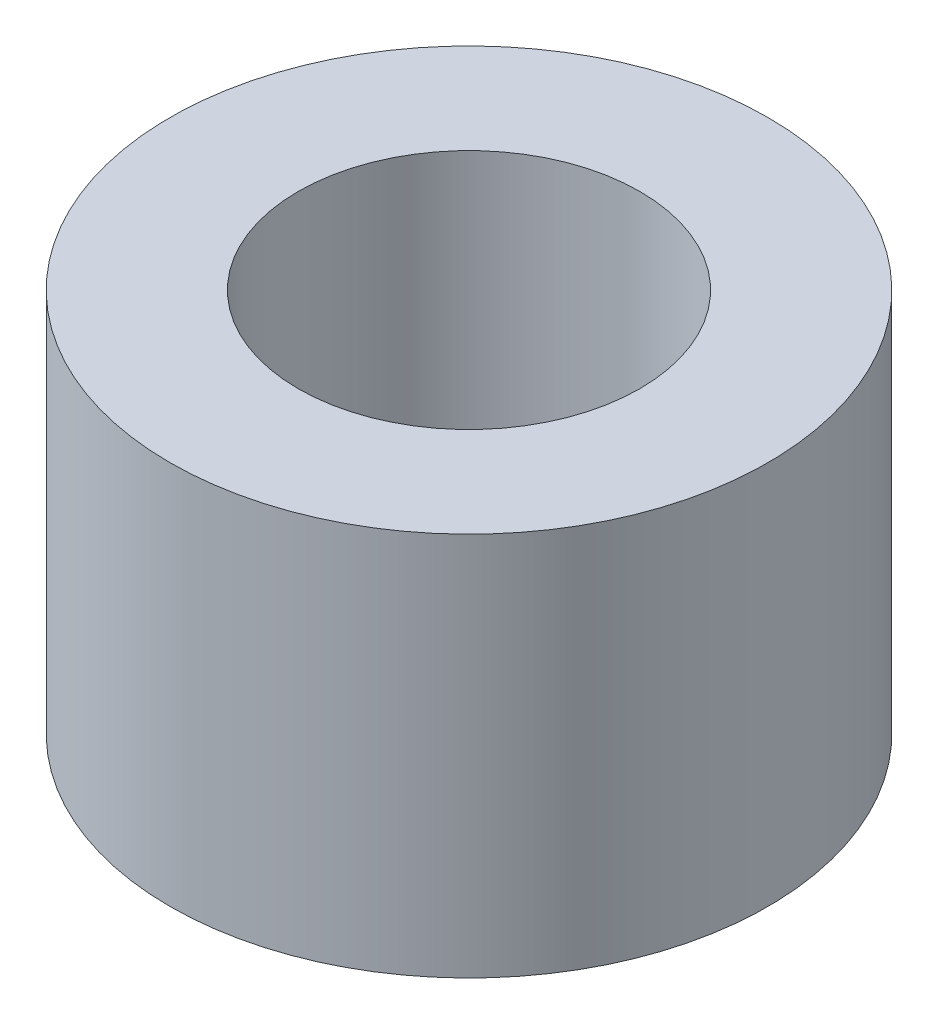
ISO-10303-21;
HEADER;
FILE_DESCRIPTION(('STEP AP214'),'2;1');
FILE_NAME('part.step','',(''),(''),'','','');
FILE_SCHEMA(('AUTOMOTIVE_DESIGN { 1 0 10303 214 1 1 1 1 }'));
ENDSEC;
DATA;
#1=APPLICATION_CONTEXT('core data for automotive mechanical design processes');
#2=APPLICATION_PROTOCOL_DEFINITION('international standard','automotive_design',2000,#1);
#3=PRODUCT_CONTEXT('',#1,'mechanical');
#4=PRODUCT('Part','Part','',(#3));
#5=PRODUCT_RELATED_PRODUCT_CATEGORY('part','',(#4));
#6=PRODUCT_DEFINITION_FORMATION('','',#4);
#7=PRODUCT_DEFINITION_CONTEXT('part definition',#1,'design');
#8=PRODUCT_DEFINITION('design','',#6,#7);
#9=PRODUCT_DEFINITION_SHAPE('','',#8);
#10=(LENGTH_UNIT() NAMED_UNIT(*) SI_UNIT(.MILLI.,.METRE.));
#11=(NAMED_UNIT(*) PLANE_ANGLE_UNIT() SI_UNIT($,.RADIAN.));
#12=(NAMED_UNIT(*) SI_UNIT($,.STERADIAN.) SOLID_ANGLE_UNIT());
#13=UNCERTAINTY_MEASURE_WITH_UNIT(LENGTH_MEASURE(1.E-05),#10,'distance_accuracy_value','');
#14=(GEOMETRIC_REPRESENTATION_CONTEXT(3) GLOBAL_UNCERTAINTY_ASSIGNED_CONTEXT((#13)) GLOBAL_UNIT_ASSIGNED_CONTEXT((#10,
#11,#12)) REPRESENTATION_CONTEXT('',''));
#15=CARTESIAN_POINT('',(0.,0.,0.));
#16=DIRECTION('',(0.,0.,1.));
#17=DIRECTION('',(1.,0.,0.));
#18=AXIS2_PLACEMENT_3D('',#15,#16,#17);
#19=CARTESIAN_POINT('',(0.,9.,0.));
#20=DIRECTION('',(0.,1.,0.));
#21=DIRECTION('',(0.,0.,1.));
#22=AXIS2_PLACEMENT_3D('',#19,#20,#21);
#23=PLANE('',#22);
#24=CARTESIAN_POINT('',(0.,9.,0.));
#25=DIRECTION('',(0.,1.,0.));
#26=DIRECTION('',(0.,0.,1.));
#27=AXIS2_PLACEMENT_3D('',#24,#25,#26);
#28=CIRCLE('',#27,7.);
#29=CARTESIAN_POINT('',(0.,9.,7.));
#30=VERTEX_POINT('',#29);
#31=EDGE_CURVE('E10',#30,#30,#28,.T.);
#32=ORIENTED_EDGE('',*,*,#31,.T.);
#33=EDGE_LOOP('',(#32));
#34=FACE_BOUND('',#33,.T.);
#35=CARTESIAN_POINT('',(0.,9.,0.));
#36=DIRECTION('',(0.,1.,0.));
#37=DIRECTION('',(0.,0.,1.));
#38=AXIS2_PLACEMENT_3D('',#35,#36,#37);
#39=CIRCLE('',#38,4.);
#40=CARTESIAN_POINT('',(0.,9.,4.));
#41=VERTEX_POINT('',#40);
#42=EDGE_CURVE('E46',#41,#41,#39,.T.);
#43=ORIENTED_EDGE('',*,*,#42,.F.);
#44=EDGE_LOOP('',(#43));
#45=FACE_BOUND('',#44,.T.);
#46=ADVANCED_FACE('F35',(#34,#45),#23,.T.);
#47=CARTESIAN_POINT('',(0.,0.,0.));
#48=DIRECTION('',(0.,1.,0.));
#49=DIRECTION('',(0.,0.,1.));
#50=AXIS2_PLACEMENT_3D('',#47,#48,#49);
#51=PLANE('',#50);
#52=CARTESIAN_POINT('',(0.,0.,0.));
#53=DIRECTION('',(0.,1.,0.));
#54=DIRECTION('',(0.,0.,1.));
#55=AXIS2_PLACEMENT_3D('',#52,#53,#54);
#56=CIRCLE('',#55,7.);
#57=CARTESIAN_POINT('',(0.,0.,7.));
#58=VERTEX_POINT('',#57);
#59=EDGE_CURVE('E39',#58,#58,#56,.T.);
#60=ORIENTED_EDGE('',*,*,#59,.F.);
#61=EDGE_LOOP('',(#60));
#62=FACE_BOUND('',#61,.T.);
#63=CARTESIAN_POINT('',(0.,0.,0.));
#64=DIRECTION('',(0.,1.,0.));
#65=DIRECTION('',(0.,0.,1.));
#66=AXIS2_PLACEMENT_3D('',#63,#64,#65);
#67=CIRCLE('',#66,4.);
#68=CARTESIAN_POINT('',(0.,0.,4.));
#69=VERTEX_POINT('',#68);
#70=EDGE_CURVE('E48',#69,#69,#67,.T.);
#71=ORIENTED_EDGE('',*,*,#70,.T.);
#72=EDGE_LOOP('',(#71));
#73=FACE_BOUND('',#72,.T.);
#74=ADVANCED_FACE('F58',(#62,#73),#51,.F.);
#75=CARTESIAN_POINT('',(0.,9.,0.));
#76=DIRECTION('',(0.,-1.,0.));
#77=DIRECTION('',(0.,0.,-1.));
#78=AXIS2_PLACEMENT_3D('',#75,#76,#77);
#79=CYLINDRICAL_SURFACE('',#78,7.);
#80=ORIENTED_EDGE('',*,*,#31,.F.);
#81=EDGE_LOOP('',(#80));
#82=FACE_BOUND('',#81,.T.);
#83=ORIENTED_EDGE('',*,*,#59,.T.);
#84=EDGE_LOOP('',(#83));
#85=FACE_BOUND('',#84,.T.);
#86=ADVANCED_FACE('F37',(#82,#85),#79,.T.);
#87=CARTESIAN_POINT('',(0.,9.,0.));
#88=DIRECTION('',(0.,-1.,0.));
#89=DIRECTION('',(0.,0.,-1.));
#90=AXIS2_PLACEMENT_3D('',#87,#88,#89);
#91=CYLINDRICAL_SURFACE('',#90,4.);
#92=ORIENTED_EDGE('',*,*,#42,.T.);
#93=EDGE_LOOP('',(#92));
#94=FACE_BOUND('',#93,.T.);
#95=ORIENTED_EDGE('',*,*,#70,.F.);
#96=EDGE_LOOP('',(#95));
#97=FACE_BOUND('',#96,.T.);
#98=ADVANCED_FACE('F54',(#94,#97),#91,.F.);
#99=CLOSED_SHELL('',(#46,#74,#86,#98));
#100=MANIFOLD_SOLID_BREP('B2',#99);
#101=ADVANCED_BREP_SHAPE_REPRESENTATION('',(#18,#100),#14);
#102=SHAPE_DEFINITION_REPRESENTATION(#9,#101);
ENDSEC;
END-ISO-10303-21;
